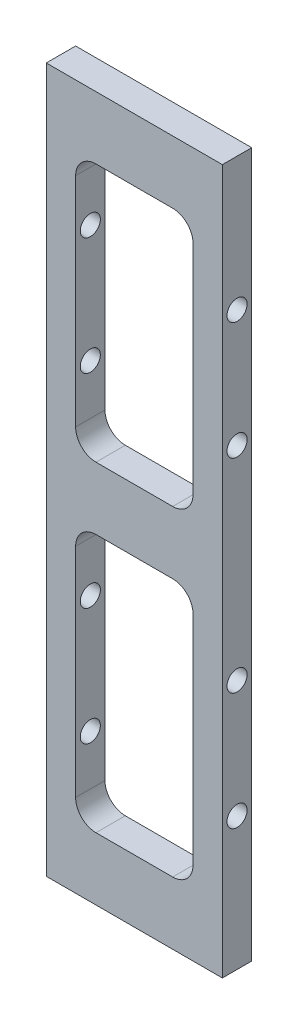
ISO-10303-21;
HEADER;
FILE_DESCRIPTION(('STEP AP214'),'2;1');
FILE_NAME('part.step','',(''),(''),'','','');
FILE_SCHEMA(('AUTOMOTIVE_DESIGN { 1 0 10303 214 1 1 1 1 }'));
ENDSEC;
DATA;
#1=APPLICATION_CONTEXT('core data for automotive mechanical design processes');
#2=APPLICATION_PROTOCOL_DEFINITION('international standard','automotive_design',2000,#1);
#3=PRODUCT_CONTEXT('',#1,'mechanical');
#4=PRODUCT('Part','Part','',(#3));
#5=PRODUCT_RELATED_PRODUCT_CATEGORY('part','',(#4));
#6=PRODUCT_DEFINITION_FORMATION('','',#4);
#7=PRODUCT_DEFINITION_CONTEXT('part definition',#1,'design');
#8=PRODUCT_DEFINITION('design','',#6,#7);
#9=PRODUCT_DEFINITION_SHAPE('','',#8);
#10=(LENGTH_UNIT() NAMED_UNIT(*) SI_UNIT(.MILLI.,.METRE.));
#11=(NAMED_UNIT(*) PLANE_ANGLE_UNIT() SI_UNIT($,.RADIAN.));
#12=(NAMED_UNIT(*) SI_UNIT($,.STERADIAN.) SOLID_ANGLE_UNIT());
#13=UNCERTAINTY_MEASURE_WITH_UNIT(LENGTH_MEASURE(1.E-05),#10,'distance_accuracy_value','');
#14=(GEOMETRIC_REPRESENTATION_CONTEXT(3) GLOBAL_UNCERTAINTY_ASSIGNED_CONTEXT((#13)) GLOBAL_UNIT_ASSIGNED_CONTEXT((#10,
#11,#12)) REPRESENTATION_CONTEXT('',''));
#15=CARTESIAN_POINT('',(0.,0.,0.));
#16=DIRECTION('',(0.,0.,1.));
#17=DIRECTION('',(1.,0.,0.));
#18=AXIS2_PLACEMENT_3D('',#15,#16,#17);
#19=CARTESIAN_POINT('',(14.2875,-57.15,4.7625));
#20=DIRECTION('',(-1.,0.,0.));
#21=DIRECTION('',(0.,0.,1.));
#22=AXIS2_PLACEMENT_3D('',#19,#20,#21);
#23=PLANE('',#22);
#24=CARTESIAN_POINT('',(14.2875,35.56,2.38125));
#25=DIRECTION('',(1.,0.,0.));
#26=DIRECTION('',(0.,0.,-1.));
#27=AXIS2_PLACEMENT_3D('',#24,#25,#26);
#28=CIRCLE('',#27,1.63194999999999);
#29=CARTESIAN_POINT('',(14.2875,35.56,0.749300000000011));
#30=VERTEX_POINT('',#29);
#31=EDGE_CURVE('E518',#30,#30,#28,.T.);
#32=ORIENTED_EDGE('',*,*,#31,.F.);
#33=EDGE_LOOP('',(#32));
#34=FACE_BOUND('',#33,.T.);
#35=CARTESIAN_POINT('',(14.2875,16.51,2.38125));
#36=DIRECTION('',(1.,0.,0.));
#37=DIRECTION('',(0.,0.,-1.));
#38=AXIS2_PLACEMENT_3D('',#35,#36,#37);
#39=CIRCLE('',#38,1.63194999999999);
#40=CARTESIAN_POINT('',(14.2875,16.51,0.749300000000006));
#41=VERTEX_POINT('',#40);
#42=EDGE_CURVE('E292',#41,#41,#39,.T.);
#43=ORIENTED_EDGE('',*,*,#42,.F.);
#44=EDGE_LOOP('',(#43));
#45=FACE_BOUND('',#44,.T.);
#46=CARTESIAN_POINT('',(14.2875,-16.51,2.38124999999999));
#47=DIRECTION('',(1.,0.,0.));
#48=DIRECTION('',(0.,0.,-1.));
#49=AXIS2_PLACEMENT_3D('',#46,#47,#48);
#50=CIRCLE('',#49,1.63194999999999);
#51=CARTESIAN_POINT('',(14.2875,-16.51,0.749300000000003));
#52=VERTEX_POINT('',#51);
#53=EDGE_CURVE('E289',#52,#52,#50,.T.);
#54=ORIENTED_EDGE('',*,*,#53,.F.);
#55=EDGE_LOOP('',(#54));
#56=FACE_BOUND('',#55,.T.);
#57=CARTESIAN_POINT('',(14.2875,-35.56,2.38124999999999));
#58=DIRECTION('',(1.,0.,0.));
#59=DIRECTION('',(0.,0.,-1.));
#60=AXIS2_PLACEMENT_3D('',#57,#58,#59);
#61=CIRCLE('',#60,1.63194999999999);
#62=CARTESIAN_POINT('',(14.2875,-35.56,0.749300000000003));
#63=VERTEX_POINT('',#62);
#64=EDGE_CURVE('E307',#63,#63,#61,.T.);
#65=ORIENTED_EDGE('',*,*,#64,.F.);
#66=EDGE_LOOP('',(#65));
#67=FACE_BOUND('',#66,.T.);
#68=DIRECTION('',(0.,1.,0.));
#69=VECTOR('',#68,1.);
#70=CARTESIAN_POINT('',(14.2875,-57.15,0.));
#71=LINE('',#70,#69);
#72=CARTESIAN_POINT('',(14.2875,-57.15,0.));
#73=VERTEX_POINT('',#72);
#74=CARTESIAN_POINT('',(14.2875,57.15,0.));
#75=VERTEX_POINT('',#74);
#76=EDGE_CURVE('E200',#73,#75,#71,.T.);
#77=ORIENTED_EDGE('',*,*,#76,.T.);
#78=DIRECTION('',(0.,0.,-1.));
#79=VECTOR('',#78,1.);
#80=CARTESIAN_POINT('',(14.2875,57.15,4.7625));
#81=LINE('',#80,#79);
#82=CARTESIAN_POINT('',(14.2875,57.15,4.7625));
#83=VERTEX_POINT('',#82);
#84=EDGE_CURVE('E181',#83,#75,#81,.T.);
#85=ORIENTED_EDGE('',*,*,#84,.F.);
#86=DIRECTION('',(0.,1.,0.));
#87=VECTOR('',#86,1.);
#88=CARTESIAN_POINT('',(14.2875,-57.15,4.7625));
#89=LINE('',#88,#87);
#90=CARTESIAN_POINT('',(14.2875,-57.15,4.7625));
#91=VERTEX_POINT('',#90);
#92=EDGE_CURVE('E188',#91,#83,#89,.T.);
#93=ORIENTED_EDGE('',*,*,#92,.F.);
#94=DIRECTION('',(0.,0.,-1.));
#95=VECTOR('',#94,1.);
#96=CARTESIAN_POINT('',(14.2875,-57.15,4.7625));
#97=LINE('',#96,#95);
#98=EDGE_CURVE('E361',#91,#73,#97,.T.);
#99=ORIENTED_EDGE('',*,*,#98,.T.);
#100=EDGE_LOOP('',(#77,#85,#93,#99));
#101=FACE_BOUND('',#100,.T.);
#102=ADVANCED_FACE('F37',(#34,#45,#56,#67,#101),#23,.F.);
#103=CARTESIAN_POINT('',(-14.2875,57.15,4.7625));
#104=DIRECTION('',(0.,-1.,0.));
#105=DIRECTION('',(0.,0.,-1.));
#106=AXIS2_PLACEMENT_3D('',#103,#104,#105);
#107=PLANE('',#106);
#108=DIRECTION('',(-1.,0.,0.));
#109=VECTOR('',#108,1.);
#110=CARTESIAN_POINT('',(-14.2875,57.15,0.));
#111=LINE('',#110,#109);
#112=CARTESIAN_POINT('',(-14.2875,57.15,0.));
#113=VERTEX_POINT('',#112);
#114=EDGE_CURVE('E363',#75,#113,#111,.T.);
#115=ORIENTED_EDGE('',*,*,#114,.T.);
#116=DIRECTION('',(0.,0.,-1.));
#117=VECTOR('',#116,1.);
#118=CARTESIAN_POINT('',(-14.2875,57.15,4.7625));
#119=LINE('',#118,#117);
#120=CARTESIAN_POINT('',(-14.2875,57.15,4.7625));
#121=VERTEX_POINT('',#120);
#122=EDGE_CURVE('E184',#121,#113,#119,.T.);
#123=ORIENTED_EDGE('',*,*,#122,.F.);
#124=DIRECTION('',(-1.,0.,0.));
#125=VECTOR('',#124,1.);
#126=CARTESIAN_POINT('',(-14.2875,57.15,4.7625));
#127=LINE('',#126,#125);
#128=EDGE_CURVE('E177',#83,#121,#127,.T.);
#129=ORIENTED_EDGE('',*,*,#128,.F.);
#130=ORIENTED_EDGE('',*,*,#84,.T.);
#131=EDGE_LOOP('',(#115,#123,#129,#130));
#132=FACE_BOUND('',#131,.T.);
#133=ADVANCED_FACE('F179',(#132),#107,.F.);
#134=CARTESIAN_POINT('',(-14.2875,-57.15,4.7625));
#135=DIRECTION('',(1.,0.,0.));
#136=DIRECTION('',(0.,0.,-1.));
#137=AXIS2_PLACEMENT_3D('',#134,#135,#136);
#138=PLANE('',#137);
#139=CARTESIAN_POINT('',(-14.2875,35.56,2.38125));
#140=DIRECTION('',(1.,0.,0.));
#141=DIRECTION('',(0.,0.,-1.));
#142=AXIS2_PLACEMENT_3D('',#139,#140,#141);
#143=CIRCLE('',#142,1.63194999999999);
#144=CARTESIAN_POINT('',(-14.2875,35.56,0.749300000000004));
#145=VERTEX_POINT('',#144);
#146=EDGE_CURVE('E517',#145,#145,#143,.T.);
#147=ORIENTED_EDGE('',*,*,#146,.T.);
#148=EDGE_LOOP('',(#147));
#149=FACE_BOUND('',#148,.T.);
#150=CARTESIAN_POINT('',(-14.2875,16.51,2.38125));
#151=DIRECTION('',(1.,0.,0.));
#152=DIRECTION('',(0.,0.,-1.));
#153=AXIS2_PLACEMENT_3D('',#150,#151,#152);
#154=CIRCLE('',#153,1.63194999999999);
#155=CARTESIAN_POINT('',(-14.2875,16.51,0.749300000000002));
#156=VERTEX_POINT('',#155);
#157=EDGE_CURVE('E285',#156,#156,#154,.T.);
#158=ORIENTED_EDGE('',*,*,#157,.T.);
#159=EDGE_LOOP('',(#158));
#160=FACE_BOUND('',#159,.T.);
#161=CARTESIAN_POINT('',(-14.2875,-16.51,2.38124999999999));
#162=DIRECTION('',(1.,0.,0.));
#163=DIRECTION('',(0.,0.,-1.));
#164=AXIS2_PLACEMENT_3D('',#161,#162,#163);
#165=CIRCLE('',#164,1.63194999999999);
#166=CARTESIAN_POINT('',(-14.2875,-16.51,0.749299999999998));
#167=VERTEX_POINT('',#166);
#168=EDGE_CURVE('E281',#167,#167,#165,.T.);
#169=ORIENTED_EDGE('',*,*,#168,.T.);
#170=EDGE_LOOP('',(#169));
#171=FACE_BOUND('',#170,.T.);
#172=CARTESIAN_POINT('',(-14.2875,-35.56,2.38124999999999));
#173=DIRECTION('',(1.,0.,0.));
#174=DIRECTION('',(0.,0.,-1.));
#175=AXIS2_PLACEMENT_3D('',#172,#173,#174);
#176=CIRCLE('',#175,1.63194999999999);
#177=CARTESIAN_POINT('',(-14.2875,-35.56,0.749299999999996));
#178=VERTEX_POINT('',#177);
#179=EDGE_CURVE('E277',#178,#178,#176,.T.);
#180=ORIENTED_EDGE('',*,*,#179,.T.);
#181=EDGE_LOOP('',(#180));
#182=FACE_BOUND('',#181,.T.);
#183=DIRECTION('',(0.,-1.,0.));
#184=VECTOR('',#183,1.);
#185=CARTESIAN_POINT('',(-14.2875,-57.15,0.));
#186=LINE('',#185,#184);
#187=CARTESIAN_POINT('',(-14.2875,-57.15,0.));
#188=VERTEX_POINT('',#187);
#189=EDGE_CURVE('E365',#113,#188,#186,.T.);
#190=ORIENTED_EDGE('',*,*,#189,.T.);
#191=DIRECTION('',(0.,0.,-1.));
#192=VECTOR('',#191,1.);
#193=CARTESIAN_POINT('',(-14.2875,-57.15,4.7625));
#194=LINE('',#193,#192);
#195=CARTESIAN_POINT('',(-14.2875,-57.15,4.7625));
#196=VERTEX_POINT('',#195);
#197=EDGE_CURVE('E205',#196,#188,#194,.T.);
#198=ORIENTED_EDGE('',*,*,#197,.F.);
#199=DIRECTION('',(0.,-1.,0.));
#200=VECTOR('',#199,1.);
#201=CARTESIAN_POINT('',(-14.2875,-57.15,4.7625));
#202=LINE('',#201,#200);
#203=EDGE_CURVE('E187',#121,#196,#202,.T.);
#204=ORIENTED_EDGE('',*,*,#203,.F.);
#205=ORIENTED_EDGE('',*,*,#122,.T.);
#206=EDGE_LOOP('',(#190,#198,#204,#205));
#207=FACE_BOUND('',#206,.T.);
#208=ADVANCED_FACE('F377',(#149,#160,#171,#182,#207),#138,.F.);
#209=CARTESIAN_POINT('',(-14.2875,-57.15,4.7625));
#210=DIRECTION('',(0.,1.,0.));
#211=DIRECTION('',(0.,0.,1.));
#212=AXIS2_PLACEMENT_3D('',#209,#210,#211);
#213=PLANE('',#212);
#214=DIRECTION('',(1.,0.,0.));
#215=VECTOR('',#214,1.);
#216=CARTESIAN_POINT('',(-14.2875,-57.15,0.));
#217=LINE('',#216,#215);
#218=EDGE_CURVE('E197',#188,#73,#217,.T.);
#219=ORIENTED_EDGE('',*,*,#218,.T.);
#220=ORIENTED_EDGE('',*,*,#98,.F.);
#221=DIRECTION('',(1.,0.,0.));
#222=VECTOR('',#221,1.);
#223=CARTESIAN_POINT('',(-14.2875,-57.15,4.7625));
#224=LINE('',#223,#222);
#225=EDGE_CURVE('E193',#196,#91,#224,.T.);
#226=ORIENTED_EDGE('',*,*,#225,.F.);
#227=ORIENTED_EDGE('',*,*,#197,.T.);
#228=EDGE_LOOP('',(#219,#220,#226,#227));
#229=FACE_BOUND('',#228,.T.);
#230=ADVANCED_FACE('F372',(#229),#213,.F.);
#231=CARTESIAN_POINT('',(0.,0.,4.7625));
#232=DIRECTION('',(0.,0.,-1.));
#233=DIRECTION('',(-1.,0.,0.));
#234=AXIS2_PLACEMENT_3D('',#231,#232,#233);
#235=PLANE('',#234);
#236=DIRECTION('',(1.,0.,0.));
#237=VECTOR('',#236,1.);
#238=CARTESIAN_POINT('',(-9.52500000000001,-46.99,4.7625));
#239=LINE('',#238,#237);
#240=CARTESIAN_POINT('',(-6.22300000000001,-46.99,4.7625));
#241=VERTEX_POINT('',#240);
#242=CARTESIAN_POINT('',(6.223,-46.99,4.7625));
#243=VERTEX_POINT('',#242);
#244=EDGE_CURVE('E331',#241,#243,#239,.T.);
#245=ORIENTED_EDGE('',*,*,#244,.F.);
#246=CARTESIAN_POINT('',(-6.22300000000001,-43.688,4.7625));
#247=DIRECTION('',(0.,0.,-1.));
#248=DIRECTION('',(-1.,0.,0.));
#249=AXIS2_PLACEMENT_3D('',#246,#247,#248);
#250=CIRCLE('',#249,3.302);
#251=CARTESIAN_POINT('',(-9.52500000000001,-43.688,4.7625));
#252=VERTEX_POINT('',#251);
#253=EDGE_CURVE('E245',#241,#252,#250,.T.);
#254=ORIENTED_EDGE('',*,*,#253,.T.);
#255=DIRECTION('',(0.,-1.,0.));
#256=VECTOR('',#255,1.);
#257=CARTESIAN_POINT('',(-9.52500000000001,-5.08,4.7625));
#258=LINE('',#257,#256);
#259=CARTESIAN_POINT('',(-9.52500000000001,-8.382,4.7625));
#260=VERTEX_POINT('',#259);
#261=EDGE_CURVE('E314',#260,#252,#258,.T.);
#262=ORIENTED_EDGE('',*,*,#261,.F.);
#263=CARTESIAN_POINT('',(-6.22300000000001,-8.382,4.7625));
#264=DIRECTION('',(0.,0.,-1.));
#265=DIRECTION('',(-1.,0.,0.));
#266=AXIS2_PLACEMENT_3D('',#263,#264,#265);
#267=CIRCLE('',#266,3.302);
#268=CARTESIAN_POINT('',(-6.22300000000001,-5.08,4.7625));
#269=VERTEX_POINT('',#268);
#270=EDGE_CURVE('E253',#260,#269,#267,.T.);
#271=ORIENTED_EDGE('',*,*,#270,.T.);
#272=DIRECTION('',(-1.,0.,0.));
#273=VECTOR('',#272,1.);
#274=CARTESIAN_POINT('',(-9.52500000000001,-5.08,4.7625));
#275=LINE('',#274,#273);
#276=CARTESIAN_POINT('',(6.223,-5.08,4.7625));
#277=VERTEX_POINT('',#276);
#278=EDGE_CURVE('E319',#277,#269,#275,.T.);
#279=ORIENTED_EDGE('',*,*,#278,.F.);
#280=CARTESIAN_POINT('',(6.223,-8.382,4.7625));
#281=DIRECTION('',(0.,0.,-1.));
#282=DIRECTION('',(-1.,0.,0.));
#283=AXIS2_PLACEMENT_3D('',#280,#281,#282);
#284=CIRCLE('',#283,3.302);
#285=CARTESIAN_POINT('',(9.52500000000001,-8.382,4.7625));
#286=VERTEX_POINT('',#285);
#287=EDGE_CURVE('E257',#277,#286,#284,.T.);
#288=ORIENTED_EDGE('',*,*,#287,.T.);
#289=DIRECTION('',(0.,1.,0.));
#290=VECTOR('',#289,1.);
#291=CARTESIAN_POINT('',(9.52500000000001,-5.08,4.7625));
#292=LINE('',#291,#290);
#293=CARTESIAN_POINT('',(9.525,-43.688,4.7625));
#294=VERTEX_POINT('',#293);
#295=EDGE_CURVE('E334',#294,#286,#292,.T.);
#296=ORIENTED_EDGE('',*,*,#295,.F.);
#297=CARTESIAN_POINT('',(6.223,-43.688,4.7625));
#298=DIRECTION('',(0.,0.,-1.));
#299=DIRECTION('',(-1.,0.,0.));
#300=AXIS2_PLACEMENT_3D('',#297,#298,#299);
#301=CIRCLE('',#300,3.302);
#302=EDGE_CURVE('E249',#294,#243,#301,.T.);
#303=ORIENTED_EDGE('',*,*,#302,.T.);
#304=EDGE_LOOP('',(#245,#254,#262,#271,#279,#288,#296,#303));
#305=FACE_BOUND('',#304,.T.);
#306=DIRECTION('',(-1.,0.,0.));
#307=VECTOR('',#306,1.);
#308=CARTESIAN_POINT('',(-9.52500000000001,46.99,4.7625));
#309=LINE('',#308,#307);
#310=CARTESIAN_POINT('',(6.223,46.99,4.7625));
#311=VERTEX_POINT('',#310);
#312=CARTESIAN_POINT('',(-6.22300000000001,46.99,4.7625));
#313=VERTEX_POINT('',#312);
#314=EDGE_CURVE('E352',#311,#313,#309,.T.);
#315=ORIENTED_EDGE('',*,*,#314,.F.);
#316=CARTESIAN_POINT('',(6.223,43.688,4.7625));
#317=DIRECTION('',(0.,0.,-1.));
#318=DIRECTION('',(-1.,0.,0.));
#319=AXIS2_PLACEMENT_3D('',#316,#317,#318);
#320=CIRCLE('',#319,3.302);
#321=CARTESIAN_POINT('',(9.525,43.688,4.7625));
#322=VERTEX_POINT('',#321);
#323=EDGE_CURVE('E269',#311,#322,#320,.T.);
#324=ORIENTED_EDGE('',*,*,#323,.T.);
#325=DIRECTION('',(0.,1.,0.));
#326=VECTOR('',#325,1.);
#327=CARTESIAN_POINT('',(9.52500000000001,5.08,4.7625));
#328=LINE('',#327,#326);
#329=CARTESIAN_POINT('',(9.52500000000001,8.382,4.7625));
#330=VERTEX_POINT('',#329);
#331=EDGE_CURVE('E328',#330,#322,#328,.T.);
#332=ORIENTED_EDGE('',*,*,#331,.F.);
#333=CARTESIAN_POINT('',(6.22300000000001,8.382,4.7625));
#334=DIRECTION('',(0.,0.,-1.));
#335=DIRECTION('',(-1.,0.,0.));
#336=AXIS2_PLACEMENT_3D('',#333,#334,#335);
#337=CIRCLE('',#336,3.302);
#338=CARTESIAN_POINT('',(6.22300000000001,5.08,4.7625));
#339=VERTEX_POINT('',#338);
#340=EDGE_CURVE('E265',#330,#339,#337,.T.);
#341=ORIENTED_EDGE('',*,*,#340,.T.);
#342=DIRECTION('',(1.,0.,0.));
#343=VECTOR('',#342,1.);
#344=CARTESIAN_POINT('',(-9.52500000000001,5.08,4.7625));
#345=LINE('',#344,#343);
#346=CARTESIAN_POINT('',(-6.22300000000001,5.08,4.7625));
#347=VERTEX_POINT('',#346);
#348=EDGE_CURVE('E342',#347,#339,#345,.T.);
#349=ORIENTED_EDGE('',*,*,#348,.F.);
#350=CARTESIAN_POINT('',(-6.22300000000001,8.382,4.7625));
#351=DIRECTION('',(0.,0.,-1.));
#352=DIRECTION('',(-1.,0.,0.));
#353=AXIS2_PLACEMENT_3D('',#350,#351,#352);
#354=CIRCLE('',#353,3.302);
#355=CARTESIAN_POINT('',(-9.52500000000001,8.382,4.7625));
#356=VERTEX_POINT('',#355);
#357=EDGE_CURVE('E261',#347,#356,#354,.T.);
#358=ORIENTED_EDGE('',*,*,#357,.T.);
#359=DIRECTION('',(0.,-1.,0.));
#360=VECTOR('',#359,1.);
#361=CARTESIAN_POINT('',(-9.52500000000001,5.08,4.7625));
#362=LINE('',#361,#360);
#363=CARTESIAN_POINT('',(-9.52500000000001,43.688,4.7625));
#364=VERTEX_POINT('',#363);
#365=EDGE_CURVE('E354',#364,#356,#362,.T.);
#366=ORIENTED_EDGE('',*,*,#365,.F.);
#367=CARTESIAN_POINT('',(-6.22300000000001,43.688,4.7625));
#368=DIRECTION('',(0.,0.,-1.));
#369=DIRECTION('',(-1.,0.,0.));
#370=AXIS2_PLACEMENT_3D('',#367,#368,#369);
#371=CIRCLE('',#370,3.302);
#372=EDGE_CURVE('E46',#364,#313,#371,.T.);
#373=ORIENTED_EDGE('',*,*,#372,.T.);
#374=EDGE_LOOP('',(#315,#324,#332,#341,#349,#358,#366,#373));
#375=FACE_BOUND('',#374,.T.);
#376=ORIENTED_EDGE('',*,*,#92,.T.);
#377=ORIENTED_EDGE('',*,*,#128,.T.);
#378=ORIENTED_EDGE('',*,*,#203,.T.);
#379=ORIENTED_EDGE('',*,*,#225,.T.);
#380=EDGE_LOOP('',(#376,#377,#378,#379));
#381=FACE_BOUND('',#380,.T.);
#382=ADVANCED_FACE('F191',(#305,#375,#381),#235,.F.);
#383=CARTESIAN_POINT('',(0.,0.,0.));
#384=DIRECTION('',(0.,0.,-1.));
#385=DIRECTION('',(-1.,0.,0.));
#386=AXIS2_PLACEMENT_3D('',#383,#384,#385);
#387=PLANE('',#386);
#388=DIRECTION('',(-1.,0.,0.));
#389=VECTOR('',#388,1.);
#390=CARTESIAN_POINT('',(-9.52500000000001,-5.08,0.));
#391=LINE('',#390,#389);
#392=CARTESIAN_POINT('',(6.223,-5.08,0.));
#393=VERTEX_POINT('',#392);
#394=CARTESIAN_POINT('',(-6.22300000000001,-5.08,0.));
#395=VERTEX_POINT('',#394);
#396=EDGE_CURVE('E325',#393,#395,#391,.T.);
#397=ORIENTED_EDGE('',*,*,#396,.T.);
#398=CARTESIAN_POINT('',(-6.22300000000001,-8.382,0.));
#399=DIRECTION('',(0.,0.,-1.));
#400=DIRECTION('',(-1.,0.,0.));
#401=AXIS2_PLACEMENT_3D('',#398,#399,#400);
#402=CIRCLE('',#401,3.302);
#403=CARTESIAN_POINT('',(-9.52500000000001,-8.382,0.));
#404=VERTEX_POINT('',#403);
#405=EDGE_CURVE('E255',#395,#404,#402,.F.);
#406=ORIENTED_EDGE('',*,*,#405,.T.);
#407=DIRECTION('',(0.,-1.,0.));
#408=VECTOR('',#407,1.);
#409=CARTESIAN_POINT('',(-9.52500000000001,-5.08,0.));
#410=LINE('',#409,#408);
#411=CARTESIAN_POINT('',(-9.52500000000001,-43.688,0.));
#412=VERTEX_POINT('',#411);
#413=EDGE_CURVE('E315',#404,#412,#410,.T.);
#414=ORIENTED_EDGE('',*,*,#413,.T.);
#415=CARTESIAN_POINT('',(-6.22300000000001,-43.688,0.));
#416=DIRECTION('',(0.,0.,-1.));
#417=DIRECTION('',(-1.,0.,0.));
#418=AXIS2_PLACEMENT_3D('',#415,#416,#417);
#419=CIRCLE('',#418,3.302);
#420=CARTESIAN_POINT('',(-6.22300000000001,-46.99,0.));
#421=VERTEX_POINT('',#420);
#422=EDGE_CURVE('E247',#412,#421,#419,.F.);
#423=ORIENTED_EDGE('',*,*,#422,.T.);
#424=DIRECTION('',(1.,0.,0.));
#425=VECTOR('',#424,1.);
#426=CARTESIAN_POINT('',(-9.52500000000001,-46.99,0.));
#427=LINE('',#426,#425);
#428=CARTESIAN_POINT('',(6.223,-46.99,0.));
#429=VERTEX_POINT('',#428);
#430=EDGE_CURVE('E318',#421,#429,#427,.T.);
#431=ORIENTED_EDGE('',*,*,#430,.T.);
#432=CARTESIAN_POINT('',(6.223,-43.688,0.));
#433=DIRECTION('',(0.,0.,-1.));
#434=DIRECTION('',(-1.,0.,0.));
#435=AXIS2_PLACEMENT_3D('',#432,#433,#434);
#436=CIRCLE('',#435,3.302);
#437=CARTESIAN_POINT('',(9.525,-43.688,0.));
#438=VERTEX_POINT('',#437);
#439=EDGE_CURVE('E251',#429,#438,#436,.F.);
#440=ORIENTED_EDGE('',*,*,#439,.T.);
#441=DIRECTION('',(0.,1.,0.));
#442=VECTOR('',#441,1.);
#443=CARTESIAN_POINT('',(9.52500000000001,-5.08,0.));
#444=LINE('',#443,#442);
#445=CARTESIAN_POINT('',(9.52500000000001,-8.382,0.));
#446=VERTEX_POINT('',#445);
#447=EDGE_CURVE('E322',#438,#446,#444,.T.);
#448=ORIENTED_EDGE('',*,*,#447,.T.);
#449=CARTESIAN_POINT('',(6.223,-8.382,0.));
#450=DIRECTION('',(0.,0.,-1.));
#451=DIRECTION('',(-1.,0.,0.));
#452=AXIS2_PLACEMENT_3D('',#449,#450,#451);
#453=CIRCLE('',#452,3.302);
#454=EDGE_CURVE('E259',#446,#393,#453,.F.);
#455=ORIENTED_EDGE('',*,*,#454,.T.);
#456=EDGE_LOOP('',(#397,#406,#414,#423,#431,#440,#448,#455));
#457=FACE_BOUND('',#456,.T.);
#458=DIRECTION('',(1.,0.,0.));
#459=VECTOR('',#458,1.);
#460=CARTESIAN_POINT('',(-9.52500000000001,5.08,0.));
#461=LINE('',#460,#459);
#462=CARTESIAN_POINT('',(-6.22300000000001,5.08,0.));
#463=VERTEX_POINT('',#462);
#464=CARTESIAN_POINT('',(6.22300000000001,5.08,0.));
#465=VERTEX_POINT('',#464);
#466=EDGE_CURVE('E347',#463,#465,#461,.T.);
#467=ORIENTED_EDGE('',*,*,#466,.T.);
#468=CARTESIAN_POINT('',(6.22300000000001,8.382,0.));
#469=DIRECTION('',(0.,0.,-1.));
#470=DIRECTION('',(-1.,0.,0.));
#471=AXIS2_PLACEMENT_3D('',#468,#469,#470);
#472=CIRCLE('',#471,3.302);
#473=CARTESIAN_POINT('',(9.52500000000001,8.382,0.));
#474=VERTEX_POINT('',#473);
#475=EDGE_CURVE('E267',#465,#474,#472,.F.);
#476=ORIENTED_EDGE('',*,*,#475,.T.);
#477=DIRECTION('',(0.,1.,0.));
#478=VECTOR('',#477,1.);
#479=CARTESIAN_POINT('',(9.52500000000001,5.08,0.));
#480=LINE('',#479,#478);
#481=CARTESIAN_POINT('',(9.525,43.688,0.));
#482=VERTEX_POINT('',#481);
#483=EDGE_CURVE('E339',#474,#482,#480,.T.);
#484=ORIENTED_EDGE('',*,*,#483,.T.);
#485=CARTESIAN_POINT('',(6.223,43.688,0.));
#486=DIRECTION('',(0.,0.,-1.));
#487=DIRECTION('',(-1.,0.,0.));
#488=AXIS2_PLACEMENT_3D('',#485,#486,#487);
#489=CIRCLE('',#488,3.302);
#490=CARTESIAN_POINT('',(6.223,46.99,0.));
#491=VERTEX_POINT('',#490);
#492=EDGE_CURVE('E61',#482,#491,#489,.F.);
#493=ORIENTED_EDGE('',*,*,#492,.T.);
#494=DIRECTION('',(-1.,0.,0.));
#495=VECTOR('',#494,1.);
#496=CARTESIAN_POINT('',(-9.52500000000001,46.99,0.));
#497=LINE('',#496,#495);
#498=CARTESIAN_POINT('',(-6.22300000000001,46.99,0.));
#499=VERTEX_POINT('',#498);
#500=EDGE_CURVE('E341',#491,#499,#497,.T.);
#501=ORIENTED_EDGE('',*,*,#500,.T.);
#502=CARTESIAN_POINT('',(-6.22300000000001,43.688,0.));
#503=DIRECTION('',(0.,0.,-1.));
#504=DIRECTION('',(-1.,0.,0.));
#505=AXIS2_PLACEMENT_3D('',#502,#503,#504);
#506=CIRCLE('',#505,3.302);
#507=CARTESIAN_POINT('',(-9.52500000000001,43.688,0.));
#508=VERTEX_POINT('',#507);
#509=EDGE_CURVE('E11',#499,#508,#506,.F.);
#510=ORIENTED_EDGE('',*,*,#509,.T.);
#511=DIRECTION('',(0.,-1.,0.));
#512=VECTOR('',#511,1.);
#513=CARTESIAN_POINT('',(-9.52500000000001,5.08,0.));
#514=LINE('',#513,#512);
#515=CARTESIAN_POINT('',(-9.52500000000001,8.382,0.));
#516=VERTEX_POINT('',#515);
#517=EDGE_CURVE('E344',#508,#516,#514,.T.);
#518=ORIENTED_EDGE('',*,*,#517,.T.);
#519=CARTESIAN_POINT('',(-6.22300000000001,8.382,0.));
#520=DIRECTION('',(0.,0.,-1.));
#521=DIRECTION('',(-1.,0.,0.));
#522=AXIS2_PLACEMENT_3D('',#519,#520,#521);
#523=CIRCLE('',#522,3.302);
#524=EDGE_CURVE('E263',#516,#463,#523,.F.);
#525=ORIENTED_EDGE('',*,*,#524,.T.);
#526=EDGE_LOOP('',(#467,#476,#484,#493,#501,#510,#518,#525));
#527=FACE_BOUND('',#526,.T.);
#528=ORIENTED_EDGE('',*,*,#76,.F.);
#529=ORIENTED_EDGE('',*,*,#218,.F.);
#530=ORIENTED_EDGE('',*,*,#189,.F.);
#531=ORIENTED_EDGE('',*,*,#114,.F.);
#532=EDGE_LOOP('',(#528,#529,#530,#531));
#533=FACE_BOUND('',#532,.T.);
#534=ADVANCED_FACE('F376',(#457,#527,#533),#387,.T.);
#535=CARTESIAN_POINT('',(9.52500000000001,5.08,0.));
#536=DIRECTION('',(1.,0.,0.));
#537=DIRECTION('',(0.,1.,0.));
#538=AXIS2_PLACEMENT_3D('',#535,#536,#537);
#539=PLANE('',#538);
#540=CARTESIAN_POINT('',(9.525,35.56,2.38125));
#541=DIRECTION('',(1.,0.,0.));
#542=DIRECTION('',(0.,1.,0.));
#543=AXIS2_PLACEMENT_3D('',#540,#541,#542);
#544=CIRCLE('',#543,1.63194999999999);
#545=CARTESIAN_POINT('',(9.525,37.19195,2.38125));
#546=VERTEX_POINT('',#545);
#547=EDGE_CURVE('E297',#546,#546,#544,.T.);
#548=ORIENTED_EDGE('',*,*,#547,.T.);
#549=EDGE_LOOP('',(#548));
#550=FACE_BOUND('',#549,.T.);
#551=CARTESIAN_POINT('',(9.52500000000001,16.51,2.38125));
#552=DIRECTION('',(1.,0.,0.));
#553=DIRECTION('',(0.,1.,0.));
#554=AXIS2_PLACEMENT_3D('',#551,#552,#553);
#555=CIRCLE('',#554,1.63194999999999);
#556=CARTESIAN_POINT('',(9.52500000000001,18.14195,2.38125));
#557=VERTEX_POINT('',#556);
#558=EDGE_CURVE('E284',#557,#557,#555,.T.);
#559=ORIENTED_EDGE('',*,*,#558,.T.);
#560=EDGE_LOOP('',(#559));
#561=FACE_BOUND('',#560,.T.);
#562=ORIENTED_EDGE('',*,*,#483,.F.);
#563=DIRECTION('',(0.,0.,1.));
#564=VECTOR('',#563,1.);
#565=CARTESIAN_POINT('',(9.52500000000001,8.382,4.7625));
#566=LINE('',#565,#564);
#567=EDGE_CURVE('E238',#474,#330,#566,.T.);
#568=ORIENTED_EDGE('',*,*,#567,.T.);
#569=ORIENTED_EDGE('',*,*,#331,.T.);
#570=DIRECTION('',(0.,0.,1.));
#571=VECTOR('',#570,1.);
#572=CARTESIAN_POINT('',(9.525,43.688,0.));
#573=LINE('',#572,#571);
#574=EDGE_CURVE('E236',#322,#482,#573,.F.);
#575=ORIENTED_EDGE('',*,*,#574,.T.);
#576=EDGE_LOOP('',(#562,#568,#569,#575));
#577=FACE_BOUND('',#576,.T.);
#578=ADVANCED_FACE('F452',(#550,#561,#577),#539,.F.);
#579=CARTESIAN_POINT('',(-9.52500000000001,5.08,0.));
#580=DIRECTION('',(0.,-1.,0.));
#581=DIRECTION('',(0.,0.,-1.));
#582=AXIS2_PLACEMENT_3D('',#579,#580,#581);
#583=PLANE('',#582);
#584=ORIENTED_EDGE('',*,*,#466,.F.);
#585=DIRECTION('',(0.,0.,1.));
#586=VECTOR('',#585,1.);
#587=CARTESIAN_POINT('',(-6.22300000000001,5.08,4.7625));
#588=LINE('',#587,#586);
#589=EDGE_CURVE('E228',#463,#347,#588,.T.);
#590=ORIENTED_EDGE('',*,*,#589,.T.);
#591=ORIENTED_EDGE('',*,*,#348,.T.);
#592=DIRECTION('',(0.,0.,1.));
#593=VECTOR('',#592,1.);
#594=CARTESIAN_POINT('',(6.22300000000001,5.08,0.));
#595=LINE('',#594,#593);
#596=EDGE_CURVE('E226',#339,#465,#595,.F.);
#597=ORIENTED_EDGE('',*,*,#596,.T.);
#598=EDGE_LOOP('',(#584,#590,#591,#597));
#599=FACE_BOUND('',#598,.T.);
#600=ADVANCED_FACE('F446',(#599),#583,.F.);
#601=CARTESIAN_POINT('',(-9.52500000000001,5.08,0.));
#602=DIRECTION('',(-1.,0.,0.));
#603=DIRECTION('',(0.,-1.,0.));
#604=AXIS2_PLACEMENT_3D('',#601,#602,#603);
#605=PLANE('',#604);
#606=CARTESIAN_POINT('',(-9.52500000000001,35.56,2.38125));
#607=DIRECTION('',(-1.,0.,0.));
#608=DIRECTION('',(0.,-1.,0.));
#609=AXIS2_PLACEMENT_3D('',#606,#607,#608);
#610=CIRCLE('',#609,1.63194999999999);
#611=CARTESIAN_POINT('',(-9.52500000000001,33.92805,2.38125));
#612=VERTEX_POINT('',#611);
#613=EDGE_CURVE('E41',#612,#612,#610,.T.);
#614=ORIENTED_EDGE('',*,*,#613,.T.);
#615=EDGE_LOOP('',(#614));
#616=FACE_BOUND('',#615,.T.);
#617=CARTESIAN_POINT('',(-9.52500000000001,16.51,2.38125));
#618=DIRECTION('',(-1.,0.,0.));
#619=DIRECTION('',(0.,-1.,0.));
#620=AXIS2_PLACEMENT_3D('',#617,#618,#619);
#621=CIRCLE('',#620,1.63194999999999);
#622=CARTESIAN_POINT('',(-9.52500000000001,14.87805,2.38125));
#623=VERTEX_POINT('',#622);
#624=EDGE_CURVE('E282',#623,#623,#621,.T.);
#625=ORIENTED_EDGE('',*,*,#624,.T.);
#626=EDGE_LOOP('',(#625));
#627=FACE_BOUND('',#626,.T.);
#628=ORIENTED_EDGE('',*,*,#365,.T.);
#629=DIRECTION('',(0.,0.,1.));
#630=VECTOR('',#629,1.);
#631=CARTESIAN_POINT('',(-9.52500000000001,8.382,0.));
#632=LINE('',#631,#630);
#633=EDGE_CURVE('E234',#356,#516,#632,.F.);
#634=ORIENTED_EDGE('',*,*,#633,.T.);
#635=ORIENTED_EDGE('',*,*,#517,.F.);
#636=DIRECTION('',(0.,0.,1.));
#637=VECTOR('',#636,1.);
#638=CARTESIAN_POINT('',(-9.52500000000001,43.688,4.7625));
#639=LINE('',#638,#637);
#640=EDGE_CURVE('E231',#508,#364,#639,.T.);
#641=ORIENTED_EDGE('',*,*,#640,.T.);
#642=EDGE_LOOP('',(#628,#634,#635,#641));
#643=FACE_BOUND('',#642,.T.);
#644=ADVANCED_FACE('F439',(#616,#627,#643),#605,.F.);
#645=CARTESIAN_POINT('',(-9.52500000000001,46.99,0.));
#646=DIRECTION('',(0.,1.,0.));
#647=DIRECTION('',(0.,0.,1.));
#648=AXIS2_PLACEMENT_3D('',#645,#646,#647);
#649=PLANE('',#648);
#650=ORIENTED_EDGE('',*,*,#500,.F.);
#651=DIRECTION('',(0.,0.,1.));
#652=VECTOR('',#651,1.);
#653=CARTESIAN_POINT('',(6.223,46.99,4.7625));
#654=LINE('',#653,#652);
#655=EDGE_CURVE('E242',#491,#311,#654,.T.);
#656=ORIENTED_EDGE('',*,*,#655,.T.);
#657=ORIENTED_EDGE('',*,*,#314,.T.);
#658=DIRECTION('',(0.,0.,1.));
#659=VECTOR('',#658,1.);
#660=CARTESIAN_POINT('',(-6.22300000000001,46.99,0.));
#661=LINE('',#660,#659);
#662=EDGE_CURVE('E54',#313,#499,#661,.F.);
#663=ORIENTED_EDGE('',*,*,#662,.T.);
#664=EDGE_LOOP('',(#650,#656,#657,#663));
#665=FACE_BOUND('',#664,.T.);
#666=ADVANCED_FACE('F431',(#665),#649,.F.);
#667=CARTESIAN_POINT('',(-9.52500000000001,-5.08,0.));
#668=DIRECTION('',(-1.,0.,0.));
#669=DIRECTION('',(0.,-1.,0.));
#670=AXIS2_PLACEMENT_3D('',#667,#668,#669);
#671=PLANE('',#670);
#672=CARTESIAN_POINT('',(-9.52500000000001,-16.51,2.38124999999999));
#673=DIRECTION('',(-1.,0.,0.));
#674=DIRECTION('',(0.,-1.,0.));
#675=AXIS2_PLACEMENT_3D('',#672,#673,#674);
#676=CIRCLE('',#675,1.63194999999999);
#677=CARTESIAN_POINT('',(-9.52500000000001,-18.14195,2.38124999999999));
#678=VERTEX_POINT('',#677);
#679=EDGE_CURVE('E280',#678,#678,#676,.T.);
#680=ORIENTED_EDGE('',*,*,#679,.T.);
#681=EDGE_LOOP('',(#680));
#682=FACE_BOUND('',#681,.T.);
#683=CARTESIAN_POINT('',(-9.52500000000001,-35.56,2.38124999999999));
#684=DIRECTION('',(-1.,0.,0.));
#685=DIRECTION('',(0.,-1.,0.));
#686=AXIS2_PLACEMENT_3D('',#683,#684,#685);
#687=CIRCLE('',#686,1.63194999999999);
#688=CARTESIAN_POINT('',(-9.52500000000001,-37.19195,2.38124999999999));
#689=VERTEX_POINT('',#688);
#690=EDGE_CURVE('E276',#689,#689,#687,.T.);
#691=ORIENTED_EDGE('',*,*,#690,.T.);
#692=EDGE_LOOP('',(#691));
#693=FACE_BOUND('',#692,.T.);
#694=ORIENTED_EDGE('',*,*,#261,.T.);
#695=DIRECTION('',(0.,0.,1.));
#696=VECTOR('',#695,1.);
#697=CARTESIAN_POINT('',(-9.52500000000001,-43.688,0.));
#698=LINE('',#697,#696);
#699=EDGE_CURVE('E214',#252,#412,#698,.F.);
#700=ORIENTED_EDGE('',*,*,#699,.T.);
#701=ORIENTED_EDGE('',*,*,#413,.F.);
#702=DIRECTION('',(0.,0.,1.));
#703=VECTOR('',#702,1.);
#704=CARTESIAN_POINT('',(-9.52500000000001,-8.382,4.7625));
#705=LINE('',#704,#703);
#706=EDGE_CURVE('E211',#404,#260,#705,.T.);
#707=ORIENTED_EDGE('',*,*,#706,.T.);
#708=EDGE_LOOP('',(#694,#700,#701,#707));
#709=FACE_BOUND('',#708,.T.);
#710=ADVANCED_FACE('F497',(#682,#693,#709),#671,.F.);
#711=CARTESIAN_POINT('',(-9.52500000000001,-5.08,0.));
#712=DIRECTION('',(0.,1.,0.));
#713=DIRECTION('',(0.,0.,1.));
#714=AXIS2_PLACEMENT_3D('',#711,#712,#713);
#715=PLANE('',#714);
#716=ORIENTED_EDGE('',*,*,#278,.T.);
#717=DIRECTION('',(0.,0.,1.));
#718=VECTOR('',#717,1.);
#719=CARTESIAN_POINT('',(-6.22300000000001,-5.08,0.));
#720=LINE('',#719,#718);
#721=EDGE_CURVE('E224',#269,#395,#720,.F.);
#722=ORIENTED_EDGE('',*,*,#721,.T.);
#723=ORIENTED_EDGE('',*,*,#396,.F.);
#724=DIRECTION('',(0.,0.,1.));
#725=VECTOR('',#724,1.);
#726=CARTESIAN_POINT('',(6.223,-5.08,4.7625));
#727=LINE('',#726,#725);
#728=EDGE_CURVE('E221',#393,#277,#727,.T.);
#729=ORIENTED_EDGE('',*,*,#728,.T.);
#730=EDGE_LOOP('',(#716,#722,#723,#729));
#731=FACE_BOUND('',#730,.T.);
#732=ADVANCED_FACE('F490',(#731),#715,.F.);
#733=CARTESIAN_POINT('',(9.52500000000001,-5.08,0.));
#734=DIRECTION('',(1.,0.,0.));
#735=DIRECTION('',(0.,1.,0.));
#736=AXIS2_PLACEMENT_3D('',#733,#734,#735);
#737=PLANE('',#736);
#738=CARTESIAN_POINT('',(9.52500000000001,-16.51,2.38124999999999));
#739=DIRECTION('',(1.,0.,0.));
#740=DIRECTION('',(0.,1.,0.));
#741=AXIS2_PLACEMENT_3D('',#738,#739,#740);
#742=CIRCLE('',#741,1.63194999999999);
#743=CARTESIAN_POINT('',(9.52500000000001,-14.87805,2.38124999999999));
#744=VERTEX_POINT('',#743);
#745=EDGE_CURVE('E278',#744,#744,#742,.T.);
#746=ORIENTED_EDGE('',*,*,#745,.T.);
#747=EDGE_LOOP('',(#746));
#748=FACE_BOUND('',#747,.T.);
#749=CARTESIAN_POINT('',(9.525,-35.56,2.38124999999999));
#750=DIRECTION('',(1.,0.,0.));
#751=DIRECTION('',(0.,1.,0.));
#752=AXIS2_PLACEMENT_3D('',#749,#750,#751);
#753=CIRCLE('',#752,1.63194999999999);
#754=CARTESIAN_POINT('',(9.525,-33.92805,2.38124999999999));
#755=VERTEX_POINT('',#754);
#756=EDGE_CURVE('E273',#755,#755,#753,.T.);
#757=ORIENTED_EDGE('',*,*,#756,.T.);
#758=EDGE_LOOP('',(#757));
#759=FACE_BOUND('',#758,.T.);
#760=ORIENTED_EDGE('',*,*,#447,.F.);
#761=DIRECTION('',(0.,0.,1.));
#762=VECTOR('',#761,1.);
#763=CARTESIAN_POINT('',(9.525,-43.688,4.7625));
#764=LINE('',#763,#762);
#765=EDGE_CURVE('E218',#438,#294,#764,.T.);
#766=ORIENTED_EDGE('',*,*,#765,.T.);
#767=ORIENTED_EDGE('',*,*,#295,.T.);
#768=DIRECTION('',(0.,0.,1.));
#769=VECTOR('',#768,1.);
#770=CARTESIAN_POINT('',(9.52500000000001,-8.382,0.));
#771=LINE('',#770,#769);
#772=EDGE_CURVE('E216',#286,#446,#771,.F.);
#773=ORIENTED_EDGE('',*,*,#772,.T.);
#774=EDGE_LOOP('',(#760,#766,#767,#773));
#775=FACE_BOUND('',#774,.T.);
#776=ADVANCED_FACE('F484',(#748,#759,#775),#737,.F.);
#777=CARTESIAN_POINT('',(-9.52500000000001,-46.99,0.));
#778=DIRECTION('',(0.,-1.,0.));
#779=DIRECTION('',(0.,0.,-1.));
#780=AXIS2_PLACEMENT_3D('',#777,#778,#779);
#781=PLANE('',#780);
#782=ORIENTED_EDGE('',*,*,#430,.F.);
#783=DIRECTION('',(0.,0.,1.));
#784=VECTOR('',#783,1.);
#785=CARTESIAN_POINT('',(-6.22300000000001,-46.99,4.7625));
#786=LINE('',#785,#784);
#787=EDGE_CURVE('E203',#421,#241,#786,.T.);
#788=ORIENTED_EDGE('',*,*,#787,.T.);
#789=ORIENTED_EDGE('',*,*,#244,.T.);
#790=DIRECTION('',(0.,0.,1.));
#791=VECTOR('',#790,1.);
#792=CARTESIAN_POINT('',(6.223,-46.99,0.));
#793=LINE('',#792,#791);
#794=EDGE_CURVE('E201',#243,#429,#793,.F.);
#795=ORIENTED_EDGE('',*,*,#794,.T.);
#796=EDGE_LOOP('',(#782,#788,#789,#795));
#797=FACE_BOUND('',#796,.T.);
#798=ADVANCED_FACE('F400',(#797),#781,.F.);
#799=CARTESIAN_POINT('',(-6.22300000000001,-43.688,0.));
#800=DIRECTION('',(0.,0.,-1.));
#801=DIRECTION('',(-1.,0.,0.));
#802=AXIS2_PLACEMENT_3D('',#799,#800,#801);
#803=CYLINDRICAL_SURFACE('',#802,3.302);
#804=ORIENTED_EDGE('',*,*,#422,.F.);
#805=ORIENTED_EDGE('',*,*,#699,.F.);
#806=ORIENTED_EDGE('',*,*,#253,.F.);
#807=ORIENTED_EDGE('',*,*,#787,.F.);
#808=EDGE_LOOP('',(#804,#805,#806,#807));
#809=FACE_BOUND('',#808,.T.);
#810=ADVANCED_FACE('F396',(#809),#803,.F.);
#811=CARTESIAN_POINT('',(6.223,-43.688,0.));
#812=DIRECTION('',(0.,0.,-1.));
#813=DIRECTION('',(-1.,0.,0.));
#814=AXIS2_PLACEMENT_3D('',#811,#812,#813);
#815=CYLINDRICAL_SURFACE('',#814,3.302);
#816=ORIENTED_EDGE('',*,*,#439,.F.);
#817=ORIENTED_EDGE('',*,*,#794,.F.);
#818=ORIENTED_EDGE('',*,*,#302,.F.);
#819=ORIENTED_EDGE('',*,*,#765,.F.);
#820=EDGE_LOOP('',(#816,#817,#818,#819));
#821=FACE_BOUND('',#820,.T.);
#822=ADVANCED_FACE('F399',(#821),#815,.F.);
#823=CARTESIAN_POINT('',(-6.22300000000001,-8.382,0.));
#824=DIRECTION('',(0.,0.,-1.));
#825=DIRECTION('',(-1.,0.,0.));
#826=AXIS2_PLACEMENT_3D('',#823,#824,#825);
#827=CYLINDRICAL_SURFACE('',#826,3.302);
#828=ORIENTED_EDGE('',*,*,#405,.F.);
#829=ORIENTED_EDGE('',*,*,#721,.F.);
#830=ORIENTED_EDGE('',*,*,#270,.F.);
#831=ORIENTED_EDGE('',*,*,#706,.F.);
#832=EDGE_LOOP('',(#828,#829,#830,#831));
#833=FACE_BOUND('',#832,.T.);
#834=ADVANCED_FACE('F404',(#833),#827,.F.);
#835=CARTESIAN_POINT('',(6.223,-8.382,0.));
#836=DIRECTION('',(0.,0.,-1.));
#837=DIRECTION('',(-1.,0.,0.));
#838=AXIS2_PLACEMENT_3D('',#835,#836,#837);
#839=CYLINDRICAL_SURFACE('',#838,3.302);
#840=ORIENTED_EDGE('',*,*,#454,.F.);
#841=ORIENTED_EDGE('',*,*,#772,.F.);
#842=ORIENTED_EDGE('',*,*,#287,.F.);
#843=ORIENTED_EDGE('',*,*,#728,.F.);
#844=EDGE_LOOP('',(#840,#841,#842,#843));
#845=FACE_BOUND('',#844,.T.);
#846=ADVANCED_FACE('F408',(#845),#839,.F.);
#847=CARTESIAN_POINT('',(-6.22300000000001,8.382,0.));
#848=DIRECTION('',(0.,0.,-1.));
#849=DIRECTION('',(-1.,0.,0.));
#850=AXIS2_PLACEMENT_3D('',#847,#848,#849);
#851=CYLINDRICAL_SURFACE('',#850,3.302);
#852=ORIENTED_EDGE('',*,*,#524,.F.);
#853=ORIENTED_EDGE('',*,*,#633,.F.);
#854=ORIENTED_EDGE('',*,*,#357,.F.);
#855=ORIENTED_EDGE('',*,*,#589,.F.);
#856=EDGE_LOOP('',(#852,#853,#854,#855));
#857=FACE_BOUND('',#856,.T.);
#858=ADVANCED_FACE('F412',(#857),#851,.F.);
#859=CARTESIAN_POINT('',(6.22300000000001,8.382,0.));
#860=DIRECTION('',(0.,0.,-1.));
#861=DIRECTION('',(-1.,0.,0.));
#862=AXIS2_PLACEMENT_3D('',#859,#860,#861);
#863=CYLINDRICAL_SURFACE('',#862,3.302);
#864=ORIENTED_EDGE('',*,*,#475,.F.);
#865=ORIENTED_EDGE('',*,*,#596,.F.);
#866=ORIENTED_EDGE('',*,*,#340,.F.);
#867=ORIENTED_EDGE('',*,*,#567,.F.);
#868=EDGE_LOOP('',(#864,#865,#866,#867));
#869=FACE_BOUND('',#868,.T.);
#870=ADVANCED_FACE('F416',(#869),#863,.F.);
#871=CARTESIAN_POINT('',(6.223,43.688,0.));
#872=DIRECTION('',(0.,0.,-1.));
#873=DIRECTION('',(-1.,0.,0.));
#874=AXIS2_PLACEMENT_3D('',#871,#872,#873);
#875=CYLINDRICAL_SURFACE('',#874,3.302);
#876=ORIENTED_EDGE('',*,*,#492,.F.);
#877=ORIENTED_EDGE('',*,*,#574,.F.);
#878=ORIENTED_EDGE('',*,*,#323,.F.);
#879=ORIENTED_EDGE('',*,*,#655,.F.);
#880=EDGE_LOOP('',(#876,#877,#878,#879));
#881=FACE_BOUND('',#880,.T.);
#882=ADVANCED_FACE('F419',(#881),#875,.F.);
#883=CARTESIAN_POINT('',(-6.22300000000001,43.688,0.));
#884=DIRECTION('',(0.,0.,-1.));
#885=DIRECTION('',(-1.,0.,0.));
#886=AXIS2_PLACEMENT_3D('',#883,#884,#885);
#887=CYLINDRICAL_SURFACE('',#886,3.302);
#888=ORIENTED_EDGE('',*,*,#509,.F.);
#889=ORIENTED_EDGE('',*,*,#662,.F.);
#890=ORIENTED_EDGE('',*,*,#372,.F.);
#891=ORIENTED_EDGE('',*,*,#640,.F.);
#892=EDGE_LOOP('',(#888,#889,#890,#891));
#893=FACE_BOUND('',#892,.T.);
#894=ADVANCED_FACE('F39',(#893),#887,.F.);
#895=CARTESIAN_POINT('',(14.2875,-35.56,2.38124999999999));
#896=DIRECTION('',(1.,0.,0.));
#897=DIRECTION('',(0.,0.,-1.));
#898=AXIS2_PLACEMENT_3D('',#895,#896,#897);
#899=CYLINDRICAL_SURFACE('',#898,1.63194999999999);
#900=ORIENTED_EDGE('',*,*,#64,.T.);
#901=EDGE_LOOP('',(#900));
#902=FACE_BOUND('',#901,.T.);
#903=ORIENTED_EDGE('',*,*,#756,.F.);
#904=EDGE_LOOP('',(#903));
#905=FACE_BOUND('',#904,.T.);
#906=ADVANCED_FACE('F426',(#902,#905),#899,.F.);
#907=ORIENTED_EDGE('',*,*,#179,.F.);
#908=EDGE_LOOP('',(#907));
#909=FACE_BOUND('',#908,.T.);
#910=ORIENTED_EDGE('',*,*,#690,.F.);
#911=EDGE_LOOP('',(#910));
#912=FACE_BOUND('',#911,.T.);
#913=ADVANCED_FACE('F545',(#909,#912),#899,.F.);
#914=CARTESIAN_POINT('',(14.2875,-16.51,2.38124999999999));
#915=DIRECTION('',(1.,0.,0.));
#916=DIRECTION('',(0.,0.,-1.));
#917=AXIS2_PLACEMENT_3D('',#914,#915,#916);
#918=CYLINDRICAL_SURFACE('',#917,1.63194999999999);
#919=ORIENTED_EDGE('',*,*,#53,.T.);
#920=EDGE_LOOP('',(#919));
#921=FACE_BOUND('',#920,.T.);
#922=ORIENTED_EDGE('',*,*,#745,.F.);
#923=EDGE_LOOP('',(#922));
#924=FACE_BOUND('',#923,.T.);
#925=ADVANCED_FACE('F543',(#921,#924),#918,.F.);
#926=ORIENTED_EDGE('',*,*,#168,.F.);
#927=EDGE_LOOP('',(#926));
#928=FACE_BOUND('',#927,.T.);
#929=ORIENTED_EDGE('',*,*,#679,.F.);
#930=EDGE_LOOP('',(#929));
#931=FACE_BOUND('',#930,.T.);
#932=ADVANCED_FACE('F540',(#928,#931),#918,.F.);
#933=CARTESIAN_POINT('',(14.2875,16.51,2.38125));
#934=DIRECTION('',(1.,0.,0.));
#935=DIRECTION('',(0.,0.,-1.));
#936=AXIS2_PLACEMENT_3D('',#933,#934,#935);
#937=CYLINDRICAL_SURFACE('',#936,1.63194999999999);
#938=ORIENTED_EDGE('',*,*,#157,.F.);
#939=EDGE_LOOP('',(#938));
#940=FACE_BOUND('',#939,.T.);
#941=ORIENTED_EDGE('',*,*,#624,.F.);
#942=EDGE_LOOP('',(#941));
#943=FACE_BOUND('',#942,.T.);
#944=ADVANCED_FACE('F538',(#940,#943),#937,.F.);
#945=ORIENTED_EDGE('',*,*,#42,.T.);
#946=EDGE_LOOP('',(#945));
#947=FACE_BOUND('',#946,.T.);
#948=ORIENTED_EDGE('',*,*,#558,.F.);
#949=EDGE_LOOP('',(#948));
#950=FACE_BOUND('',#949,.T.);
#951=ADVANCED_FACE('F533',(#947,#950),#937,.F.);
#952=CARTESIAN_POINT('',(14.2875,35.56,2.38125));
#953=DIRECTION('',(1.,0.,0.));
#954=DIRECTION('',(0.,0.,-1.));
#955=AXIS2_PLACEMENT_3D('',#952,#953,#954);
#956=CYLINDRICAL_SURFACE('',#955,1.63194999999999);
#957=ORIENTED_EDGE('',*,*,#146,.F.);
#958=EDGE_LOOP('',(#957));
#959=FACE_BOUND('',#958,.T.);
#960=ORIENTED_EDGE('',*,*,#613,.F.);
#961=EDGE_LOOP('',(#960));
#962=FACE_BOUND('',#961,.T.);
#963=ADVANCED_FACE('F527',(#959,#962),#956,.F.);
#964=ORIENTED_EDGE('',*,*,#31,.T.);
#965=EDGE_LOOP('',(#964));
#966=FACE_BOUND('',#965,.T.);
#967=ORIENTED_EDGE('',*,*,#547,.F.);
#968=EDGE_LOOP('',(#967));
#969=FACE_BOUND('',#968,.T.);
#970=ADVANCED_FACE('F524',(#966,#969),#956,.F.);
#971=CLOSED_SHELL('',(#102,#133,#208,#230,#382,#534,#578,#600,#644,#666,#710,#732,#776,#798,
#810,#822,#834,#846,#858,#870,#882,#894,#906,#913,#925,#932,#944,#951,#963,#970));
#972=MANIFOLD_SOLID_BREP('B2',#971);
#973=ADVANCED_BREP_SHAPE_REPRESENTATION('',(#18,#972),#14);
#974=SHAPE_DEFINITION_REPRESENTATION(#9,#973);
ENDSEC;
END-ISO-10303-21;
